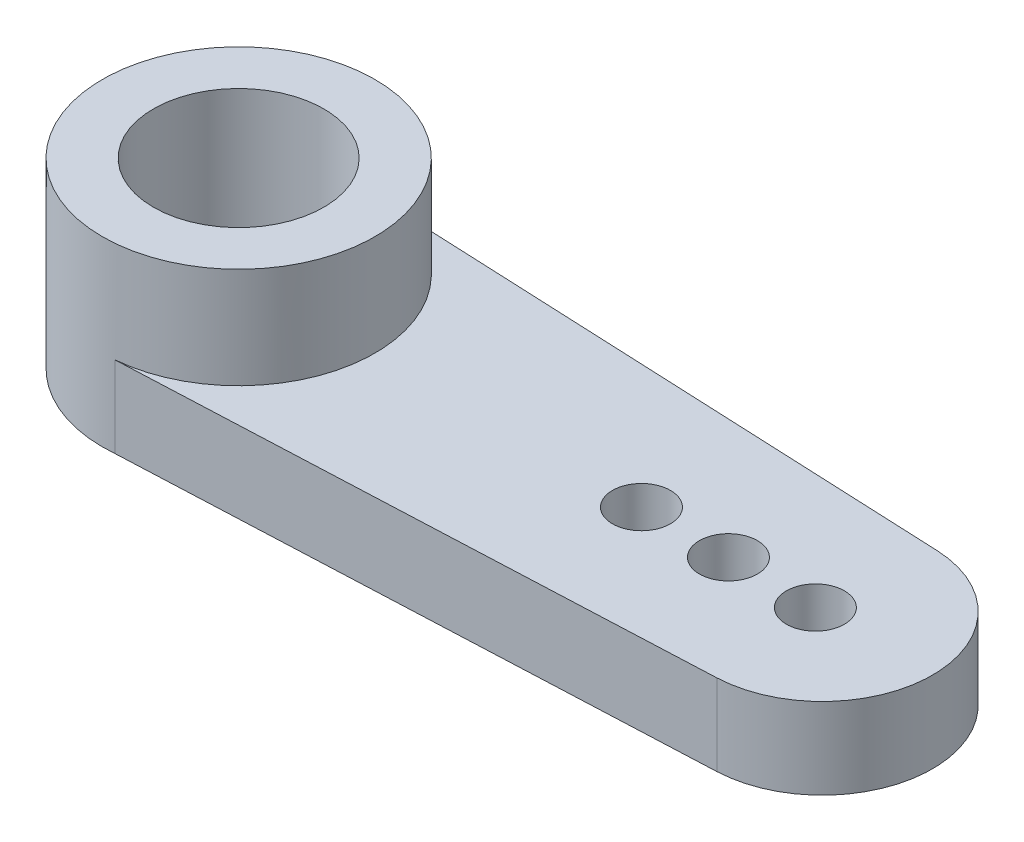
ISO-10303-21;
HEADER;
FILE_DESCRIPTION(('STEP AP214'),'2;1');
FILE_NAME('part.step','',(''),(''),'','','');
FILE_SCHEMA(('AUTOMOTIVE_DESIGN { 1 0 10303 214 1 1 1 1 }'));
ENDSEC;
DATA;
#1=APPLICATION_CONTEXT('core data for automotive mechanical design processes');
#2=APPLICATION_PROTOCOL_DEFINITION('international standard','automotive_design',2000,#1);
#3=PRODUCT_CONTEXT('',#1,'mechanical');
#4=PRODUCT('Part','Part','',(#3));
#5=PRODUCT_RELATED_PRODUCT_CATEGORY('part','',(#4));
#6=PRODUCT_DEFINITION_FORMATION('','',#4);
#7=PRODUCT_DEFINITION_CONTEXT('part definition',#1,'design');
#8=PRODUCT_DEFINITION('design','',#6,#7);
#9=PRODUCT_DEFINITION_SHAPE('','',#8);
#10=(LENGTH_UNIT() NAMED_UNIT(*) SI_UNIT(.MILLI.,.METRE.));
#11=(NAMED_UNIT(*) PLANE_ANGLE_UNIT() SI_UNIT($,.RADIAN.));
#12=(NAMED_UNIT(*) SI_UNIT($,.STERADIAN.) SOLID_ANGLE_UNIT());
#13=UNCERTAINTY_MEASURE_WITH_UNIT(LENGTH_MEASURE(1.E-05),#10,'distance_accuracy_value','');
#14=(GEOMETRIC_REPRESENTATION_CONTEXT(3) GLOBAL_UNCERTAINTY_ASSIGNED_CONTEXT((#13)) GLOBAL_UNIT_ASSIGNED_CONTEXT((#10,
#11,#12)) REPRESENTATION_CONTEXT('',''));
#15=CARTESIAN_POINT('',(0.,0.,0.));
#16=DIRECTION('',(0.,0.,1.));
#17=DIRECTION('',(1.,0.,0.));
#18=AXIS2_PLACEMENT_3D('',#15,#16,#17);
#19=CARTESIAN_POINT('',(0.,3.9878,0.));
#20=DIRECTION('',(0.,1.,0.));
#21=DIRECTION('',(0.,0.,1.));
#22=AXIS2_PLACEMENT_3D('',#19,#20,#21);
#23=PLANE('',#22);
#24=CARTESIAN_POINT('',(0.,3.9878,0.));
#25=DIRECTION('',(0.,1.,0.));
#26=DIRECTION('',(0.,0.,1.));
#27=AXIS2_PLACEMENT_3D('',#24,#25,#26);
#28=CIRCLE('',#27,2.9845);
#29=CARTESIAN_POINT('',(0.,3.9878,2.9845));
#30=VERTEX_POINT('',#29);
#31=EDGE_CURVE('E11',#30,#30,#28,.T.);
#32=ORIENTED_EDGE('',*,*,#31,.T.);
#33=EDGE_LOOP('',(#32));
#34=FACE_BOUND('',#33,.T.);
#35=CARTESIAN_POINT('',(0.,3.9878,0.));
#36=DIRECTION('',(0.,1.,0.));
#37=DIRECTION('',(0.,0.,1.));
#38=AXIS2_PLACEMENT_3D('',#35,#36,#37);
#39=CIRCLE('',#38,1.8669);
#40=CARTESIAN_POINT('',(0.,3.9878,1.8669));
#41=VERTEX_POINT('',#40);
#42=EDGE_CURVE('E122',#41,#41,#39,.T.);
#43=ORIENTED_EDGE('',*,*,#42,.F.);
#44=EDGE_LOOP('',(#43));
#45=FACE_BOUND('',#44,.T.);
#46=ADVANCED_FACE('F40',(#34,#45),#23,.T.);
#47=CARTESIAN_POINT('',(0.,0.,0.));
#48=DIRECTION('',(0.,1.,0.));
#49=DIRECTION('',(0.,0.,1.));
#50=AXIS2_PLACEMENT_3D('',#47,#48,#49);
#51=PLANE('',#50);
#52=CARTESIAN_POINT('',(12.6334900246203,0.,0.));
#53=DIRECTION('',(0.,-1.,0.));
#54=DIRECTION('',(0.,0.,-1.));
#55=AXIS2_PLACEMENT_3D('',#52,#53,#54);
#56=CIRCLE('',#55,0.635000000000001);
#57=CARTESIAN_POINT('',(12.6334900246203,0.,-0.635000000000001));
#58=VERTEX_POINT('',#57);
#59=EDGE_CURVE('E139',#58,#58,#56,.T.);
#60=ORIENTED_EDGE('',*,*,#59,.F.);
#61=EDGE_LOOP('',(#60));
#62=FACE_BOUND('',#61,.T.);
#63=CARTESIAN_POINT('',(10.7284900246203,0.,0.));
#64=DIRECTION('',(0.,-1.,0.));
#65=DIRECTION('',(0.,0.,-1.));
#66=AXIS2_PLACEMENT_3D('',#63,#64,#65);
#67=CIRCLE('',#66,0.635000000000001);
#68=CARTESIAN_POINT('',(10.7284900246203,0.,-0.635000000000001));
#69=VERTEX_POINT('',#68);
#70=EDGE_CURVE('E131',#69,#69,#67,.T.);
#71=ORIENTED_EDGE('',*,*,#70,.F.);
#72=EDGE_LOOP('',(#71));
#73=FACE_BOUND('',#72,.T.);
#74=CARTESIAN_POINT('',(8.82349002462034,0.,0.));
#75=DIRECTION('',(0.,-1.,0.));
#76=DIRECTION('',(0.,0.,-1.));
#77=AXIS2_PLACEMENT_3D('',#74,#75,#76);
#78=CIRCLE('',#77,0.635000000000001);
#79=CARTESIAN_POINT('',(8.82349002462034,0.,-0.635000000000001));
#80=VERTEX_POINT('',#79);
#81=EDGE_CURVE('E108',#80,#80,#78,.T.);
#82=ORIENTED_EDGE('',*,*,#81,.F.);
#83=EDGE_LOOP('',(#82));
#84=FACE_BOUND('',#83,.T.);
#85=CARTESIAN_POINT('',(0.,0.,0.));
#86=DIRECTION('',(0.,1.,0.));
#87=DIRECTION('',(0.,0.,1.));
#88=AXIS2_PLACEMENT_3D('',#85,#86,#87);
#89=CIRCLE('',#88,2.9845);
#90=CARTESIAN_POINT('',(0.264116323565029,0.,-2.97279040930007));
#91=VERTEX_POINT('',#90);
#92=CARTESIAN_POINT('',(0.264116323565029,0.,2.97279040930007));
#93=VERTEX_POINT('',#92);
#94=EDGE_CURVE('E49',#91,#93,#89,.T.);
#95=ORIENTED_EDGE('',*,*,#94,.F.);
#96=DIRECTION('',(0.999018651439478,0.,0.0442914673051986));
#97=VECTOR('',#96,1.);
#98=CARTESIAN_POINT('',(0.132058161782514,0.,-2.97864520465004));
#99=LINE('',#98,#97);
#100=CARTESIAN_POINT('',(12.8905,0.,-2.413));
#101=VERTEX_POINT('',#100);
#102=EDGE_CURVE('E103',#91,#101,#99,.T.);
#103=ORIENTED_EDGE('',*,*,#102,.T.);
#104=CARTESIAN_POINT('',(12.7835197044335,0.,0.));
#105=DIRECTION('',(0.,-1.,0.));
#106=DIRECTION('',(0.,0.,-1.));
#107=AXIS2_PLACEMENT_3D('',#104,#105,#106);
#108=CIRCLE('',#107,2.41537032018684);
#109=CARTESIAN_POINT('',(12.8905,0.,2.413));
#110=VERTEX_POINT('',#109);
#111=EDGE_CURVE('E113',#110,#101,#108,.F.);
#112=ORIENTED_EDGE('',*,*,#111,.F.);
#113=DIRECTION('',(0.999018651439478,0.,-0.0442914673051986));
#114=VECTOR('',#113,1.);
#115=CARTESIAN_POINT('',(0.132058161782514,0.,2.97864520465004));
#116=LINE('',#115,#114);
#117=EDGE_CURVE('E94',#93,#110,#116,.T.);
#118=ORIENTED_EDGE('',*,*,#117,.F.);
#119=EDGE_LOOP('',(#95,#103,#112,#118));
#120=FACE_BOUND('',#119,.T.);
#121=CARTESIAN_POINT('',(0.,0.,0.));
#122=DIRECTION('',(0.,1.,0.));
#123=DIRECTION('',(0.,0.,1.));
#124=AXIS2_PLACEMENT_3D('',#121,#122,#123);
#125=CIRCLE('',#124,1.8669);
#126=CARTESIAN_POINT('',(0.,0.,1.8669));
#127=VERTEX_POINT('',#126);
#128=EDGE_CURVE('E118',#127,#127,#125,.T.);
#129=ORIENTED_EDGE('',*,*,#128,.T.);
#130=EDGE_LOOP('',(#129));
#131=FACE_BOUND('',#130,.T.);
#132=ADVANCED_FACE('F147',(#62,#73,#84,#120,#131),#51,.F.);
#133=CARTESIAN_POINT('',(0.,3.9878,0.));
#134=DIRECTION('',(0.,-1.,0.));
#135=DIRECTION('',(0.,0.,-1.));
#136=AXIS2_PLACEMENT_3D('',#133,#134,#135);
#137=CYLINDRICAL_SURFACE('',#136,2.9845);
#138=CARTESIAN_POINT('',(0.,1.778,0.));
#139=DIRECTION('',(0.,-1.,0.));
#140=DIRECTION('',(0.,0.,-1.));
#141=AXIS2_PLACEMENT_3D('',#138,#139,#140);
#142=CIRCLE('',#141,2.9845);
#143=CARTESIAN_POINT('',(0.264116323565029,1.778,-2.97279040930007));
#144=VERTEX_POINT('',#143);
#145=CARTESIAN_POINT('',(0.264116323565029,1.778,2.97279040930007));
#146=VERTEX_POINT('',#145);
#147=EDGE_CURVE('E61',#144,#146,#142,.T.);
#148=ORIENTED_EDGE('',*,*,#147,.F.);
#149=DIRECTION('',(0.,-1.,0.));
#150=VECTOR('',#149,1.);
#151=CARTESIAN_POINT('',(0.264116323565029,1.778,-2.97279040930007));
#152=LINE('',#151,#150);
#153=EDGE_CURVE('E119',#144,#91,#152,.T.);
#154=ORIENTED_EDGE('',*,*,#153,.T.);
#155=ORIENTED_EDGE('',*,*,#94,.T.);
#156=DIRECTION('',(0.,-1.,0.));
#157=VECTOR('',#156,1.);
#158=CARTESIAN_POINT('',(0.264116323565029,1.778,2.97279040930007));
#159=LINE('',#158,#157);
#160=EDGE_CURVE('E57',#146,#93,#159,.T.);
#161=ORIENTED_EDGE('',*,*,#160,.F.);
#162=EDGE_LOOP('',(#148,#154,#155,#161));
#163=FACE_BOUND('',#162,.T.);
#164=ORIENTED_EDGE('',*,*,#31,.F.);
#165=EDGE_LOOP('',(#164));
#166=FACE_BOUND('',#165,.T.);
#167=ADVANCED_FACE('F42',(#163,#166),#137,.T.);
#168=CARTESIAN_POINT('',(0.,3.9878,0.));
#169=DIRECTION('',(0.,-1.,0.));
#170=DIRECTION('',(0.,0.,-1.));
#171=AXIS2_PLACEMENT_3D('',#168,#169,#170);
#172=CYLINDRICAL_SURFACE('',#171,1.8669);
#173=ORIENTED_EDGE('',*,*,#42,.T.);
#174=EDGE_LOOP('',(#173));
#175=FACE_BOUND('',#174,.T.);
#176=ORIENTED_EDGE('',*,*,#128,.F.);
#177=EDGE_LOOP('',(#176));
#178=FACE_BOUND('',#177,.T.);
#179=ADVANCED_FACE('F156',(#175,#178),#172,.F.);
#180=CARTESIAN_POINT('',(12.7835197044335,1.778,0.));
#181=DIRECTION('',(0.,-1.,0.));
#182=DIRECTION('',(0.,0.,-1.));
#183=AXIS2_PLACEMENT_3D('',#180,#181,#182);
#184=CYLINDRICAL_SURFACE('',#183,2.41537032018684);
#185=ORIENTED_EDGE('',*,*,#111,.T.);
#186=DIRECTION('',(0.,-1.,0.));
#187=VECTOR('',#186,1.);
#188=CARTESIAN_POINT('',(12.8905,1.778,-2.413));
#189=LINE('',#188,#187);
#190=CARTESIAN_POINT('',(12.8905,1.778,-2.413));
#191=VERTEX_POINT('',#190);
#192=EDGE_CURVE('E101',#191,#101,#189,.T.);
#193=ORIENTED_EDGE('',*,*,#192,.F.);
#194=CARTESIAN_POINT('',(12.7835197044335,1.778,0.));
#195=DIRECTION('',(0.,-1.,0.));
#196=DIRECTION('',(0.,0.,-1.));
#197=AXIS2_PLACEMENT_3D('',#194,#195,#196);
#198=CIRCLE('',#197,2.41537032018684);
#199=CARTESIAN_POINT('',(12.8905,1.778,2.413));
#200=VERTEX_POINT('',#199);
#201=EDGE_CURVE('E86',#200,#191,#198,.F.);
#202=ORIENTED_EDGE('',*,*,#201,.F.);
#203=DIRECTION('',(0.,-1.,0.));
#204=VECTOR('',#203,1.);
#205=CARTESIAN_POINT('',(12.8905,1.778,2.413));
#206=LINE('',#205,#204);
#207=EDGE_CURVE('E91',#200,#110,#206,.T.);
#208=ORIENTED_EDGE('',*,*,#207,.T.);
#209=EDGE_LOOP('',(#185,#193,#202,#208));
#210=FACE_BOUND('',#209,.T.);
#211=ADVANCED_FACE('F100',(#210),#184,.T.);
#212=CARTESIAN_POINT('',(0.132058161782514,1.778,-2.97864520465004));
#213=DIRECTION('',(0.0442914673051986,0.,-0.999018651439478));
#214=DIRECTION('',(-0.999018651439478,0.,-0.0442914673051986));
#215=AXIS2_PLACEMENT_3D('',#212,#213,#214);
#216=PLANE('',#215);
#217=ORIENTED_EDGE('',*,*,#102,.F.);
#218=ORIENTED_EDGE('',*,*,#153,.F.);
#219=DIRECTION('',(0.999018651439478,0.,0.0442914673051986));
#220=VECTOR('',#219,1.);
#221=CARTESIAN_POINT('',(0.132058161782514,1.778,-2.97864520465004));
#222=LINE('',#221,#220);
#223=EDGE_CURVE('E98',#144,#191,#222,.T.);
#224=ORIENTED_EDGE('',*,*,#223,.T.);
#225=ORIENTED_EDGE('',*,*,#192,.T.);
#226=EDGE_LOOP('',(#217,#218,#224,#225));
#227=FACE_BOUND('',#226,.T.);
#228=ADVANCED_FACE('F164',(#227),#216,.T.);
#229=CARTESIAN_POINT('',(0.132058161782514,1.778,2.97864520465004));
#230=DIRECTION('',(-0.0442914673051986,0.,-0.999018651439478));
#231=DIRECTION('',(-0.999018651439478,0.,0.0442914673051986));
#232=AXIS2_PLACEMENT_3D('',#229,#230,#231);
#233=PLANE('',#232);
#234=ORIENTED_EDGE('',*,*,#117,.T.);
#235=ORIENTED_EDGE('',*,*,#207,.F.);
#236=DIRECTION('',(0.999018651439478,0.,-0.0442914673051986));
#237=VECTOR('',#236,1.);
#238=CARTESIAN_POINT('',(0.132058161782514,1.778,2.97864520465004));
#239=LINE('',#238,#237);
#240=EDGE_CURVE('E81',#146,#200,#239,.T.);
#241=ORIENTED_EDGE('',*,*,#240,.F.);
#242=ORIENTED_EDGE('',*,*,#160,.T.);
#243=EDGE_LOOP('',(#234,#235,#241,#242));
#244=FACE_BOUND('',#243,.T.);
#245=ADVANCED_FACE('F92',(#244),#233,.F.);
#246=CARTESIAN_POINT('',(0.,1.778,0.));
#247=DIRECTION('',(0.,-1.,0.));
#248=DIRECTION('',(0.,0.,-1.));
#249=AXIS2_PLACEMENT_3D('',#246,#247,#248);
#250=PLANE('',#249);
#251=CARTESIAN_POINT('',(12.6334900246203,1.778,0.));
#252=DIRECTION('',(0.,-1.,0.));
#253=DIRECTION('',(0.,0.,-1.));
#254=AXIS2_PLACEMENT_3D('',#251,#252,#253);
#255=CIRCLE('',#254,0.635000000000001);
#256=CARTESIAN_POINT('',(12.6334900246203,1.778,-0.635000000000001));
#257=VERTEX_POINT('',#256);
#258=EDGE_CURVE('E44',#257,#257,#255,.T.);
#259=ORIENTED_EDGE('',*,*,#258,.T.);
#260=EDGE_LOOP('',(#259));
#261=FACE_BOUND('',#260,.T.);
#262=CARTESIAN_POINT('',(10.7284900246203,1.778,0.));
#263=DIRECTION('',(0.,-1.,0.));
#264=DIRECTION('',(0.,0.,-1.));
#265=AXIS2_PLACEMENT_3D('',#262,#263,#264);
#266=CIRCLE('',#265,0.635000000000001);
#267=CARTESIAN_POINT('',(10.7284900246203,1.778,-0.635000000000001));
#268=VERTEX_POINT('',#267);
#269=EDGE_CURVE('E129',#268,#268,#266,.T.);
#270=ORIENTED_EDGE('',*,*,#269,.T.);
#271=EDGE_LOOP('',(#270));
#272=FACE_BOUND('',#271,.T.);
#273=CARTESIAN_POINT('',(8.82349002462034,1.778,0.));
#274=DIRECTION('',(0.,-1.,0.));
#275=DIRECTION('',(0.,0.,-1.));
#276=AXIS2_PLACEMENT_3D('',#273,#274,#275);
#277=CIRCLE('',#276,0.635000000000001);
#278=CARTESIAN_POINT('',(8.82349002462034,1.778,-0.635000000000001));
#279=VERTEX_POINT('',#278);
#280=EDGE_CURVE('E115',#279,#279,#277,.T.);
#281=ORIENTED_EDGE('',*,*,#280,.T.);
#282=EDGE_LOOP('',(#281));
#283=FACE_BOUND('',#282,.T.);
#284=ORIENTED_EDGE('',*,*,#201,.T.);
#285=ORIENTED_EDGE('',*,*,#223,.F.);
#286=ORIENTED_EDGE('',*,*,#147,.T.);
#287=ORIENTED_EDGE('',*,*,#240,.T.);
#288=EDGE_LOOP('',(#284,#285,#286,#287));
#289=FACE_BOUND('',#288,.T.);
#290=ADVANCED_FACE('F83',(#261,#272,#283,#289),#250,.F.);
#291=CARTESIAN_POINT('',(8.82349002462034,3.9878,0.));
#292=DIRECTION('',(0.,-1.,0.));
#293=DIRECTION('',(0.,0.,-1.));
#294=AXIS2_PLACEMENT_3D('',#291,#292,#293);
#295=CYLINDRICAL_SURFACE('',#294,0.635000000000001);
#296=ORIENTED_EDGE('',*,*,#81,.T.);
#297=EDGE_LOOP('',(#296));
#298=FACE_BOUND('',#297,.T.);
#299=ORIENTED_EDGE('',*,*,#280,.F.);
#300=EDGE_LOOP('',(#299));
#301=FACE_BOUND('',#300,.T.);
#302=ADVANCED_FACE('F218',(#298,#301),#295,.F.);
#303=CARTESIAN_POINT('',(10.7284900246203,3.9878,0.));
#304=DIRECTION('',(0.,-1.,0.));
#305=DIRECTION('',(0.,0.,-1.));
#306=AXIS2_PLACEMENT_3D('',#303,#304,#305);
#307=CYLINDRICAL_SURFACE('',#306,0.635000000000001);
#308=ORIENTED_EDGE('',*,*,#70,.T.);
#309=EDGE_LOOP('',(#308));
#310=FACE_BOUND('',#309,.T.);
#311=ORIENTED_EDGE('',*,*,#269,.F.);
#312=EDGE_LOOP('',(#311));
#313=FACE_BOUND('',#312,.T.);
#314=ADVANCED_FACE('F225',(#310,#313),#307,.F.);
#315=CARTESIAN_POINT('',(12.6334900246203,3.9878,0.));
#316=DIRECTION('',(0.,-1.,0.));
#317=DIRECTION('',(0.,0.,-1.));
#318=AXIS2_PLACEMENT_3D('',#315,#316,#317);
#319=CYLINDRICAL_SURFACE('',#318,0.635000000000001);
#320=ORIENTED_EDGE('',*,*,#59,.T.);
#321=EDGE_LOOP('',(#320));
#322=FACE_BOUND('',#321,.T.);
#323=ORIENTED_EDGE('',*,*,#258,.F.);
#324=EDGE_LOOP('',(#323));
#325=FACE_BOUND('',#324,.T.);
#326=ADVANCED_FACE('F144',(#322,#325),#319,.F.);
#327=CLOSED_SHELL('',(#46,#132,#167,#179,#211,#228,#245,#290,#302,#314,#326));
#328=MANIFOLD_SOLID_BREP('B2',#327);
#329=ADVANCED_BREP_SHAPE_REPRESENTATION('',(#18,#328),#14);
#330=SHAPE_DEFINITION_REPRESENTATION(#9,#329);
ENDSEC;
END-ISO-10303-21;
